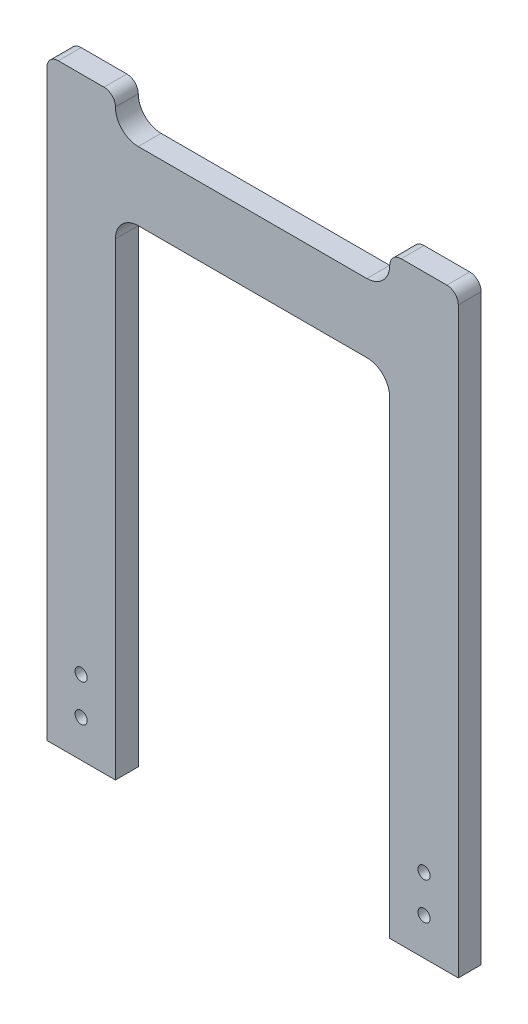
ISO-10303-21;
HEADER;
FILE_DESCRIPTION(('STEP AP214'),'2;1');
FILE_NAME('part.step','',(''),(''),'','','');
FILE_SCHEMA(('AUTOMOTIVE_DESIGN { 1 0 10303 214 1 1 1 1 }'));
ENDSEC;
DATA;
#1=APPLICATION_CONTEXT('core data for automotive mechanical design processes');
#2=APPLICATION_PROTOCOL_DEFINITION('international standard','automotive_design',2000,#1);
#3=PRODUCT_CONTEXT('',#1,'mechanical');
#4=PRODUCT('Part','Part','',(#3));
#5=PRODUCT_RELATED_PRODUCT_CATEGORY('part','',(#4));
#6=PRODUCT_DEFINITION_FORMATION('','',#4);
#7=PRODUCT_DEFINITION_CONTEXT('part definition',#1,'design');
#8=PRODUCT_DEFINITION('design','',#6,#7);
#9=PRODUCT_DEFINITION_SHAPE('','',#8);
#10=(LENGTH_UNIT() NAMED_UNIT(*) SI_UNIT(.MILLI.,.METRE.));
#11=(NAMED_UNIT(*) PLANE_ANGLE_UNIT() SI_UNIT($,.RADIAN.));
#12=(NAMED_UNIT(*) SI_UNIT($,.STERADIAN.) SOLID_ANGLE_UNIT());
#13=UNCERTAINTY_MEASURE_WITH_UNIT(LENGTH_MEASURE(1.E-05),#10,'distance_accuracy_value','');
#14=(GEOMETRIC_REPRESENTATION_CONTEXT(3) GLOBAL_UNCERTAINTY_ASSIGNED_CONTEXT((#13)) GLOBAL_UNIT_ASSIGNED_CONTEXT((#10,
#11,#12)) REPRESENTATION_CONTEXT('',''));
#15=CARTESIAN_POINT('',(0.,0.,0.));
#16=DIRECTION('',(0.,0.,1.));
#17=DIRECTION('',(1.,0.,0.));
#18=AXIS2_PLACEMENT_3D('',#15,#16,#17);
#19=CARTESIAN_POINT('',(-114.3,298.45,12.7));
#20=DIRECTION('',(1.,0.,0.));
#21=DIRECTION('',(0.,1.,0.));
#22=AXIS2_PLACEMENT_3D('',#19,#20,#21);
#23=PLANE('',#22);
#24=DIRECTION('',(0.,-1.,0.));
#25=VECTOR('',#24,1.);
#26=CARTESIAN_POINT('',(-114.3,298.45,12.7));
#27=LINE('',#26,#25);
#28=CARTESIAN_POINT('',(-114.3,292.1,12.7));
#29=VERTEX_POINT('',#28);
#30=CARTESIAN_POINT('',(-114.3,-31.75,12.7));
#31=VERTEX_POINT('',#30);
#32=EDGE_CURVE('E158',#29,#31,#27,.T.);
#33=ORIENTED_EDGE('',*,*,#32,.F.);
#34=DIRECTION('',(0.,0.,-1.));
#35=VECTOR('',#34,1.);
#36=CARTESIAN_POINT('',(-114.3,292.1,12.7));
#37=LINE('',#36,#35);
#38=CARTESIAN_POINT('',(-114.3,292.1,0.));
#39=VERTEX_POINT('',#38);
#40=EDGE_CURVE('E255',#29,#39,#37,.T.);
#41=ORIENTED_EDGE('',*,*,#40,.T.);
#42=DIRECTION('',(0.,-1.,0.));
#43=VECTOR('',#42,1.);
#44=CARTESIAN_POINT('',(-114.3,298.45,0.));
#45=LINE('',#44,#43);
#46=CARTESIAN_POINT('',(-114.3,-31.75,0.));
#47=VERTEX_POINT('',#46);
#48=EDGE_CURVE('E184',#39,#47,#45,.T.);
#49=ORIENTED_EDGE('',*,*,#48,.T.);
#50=DIRECTION('',(0.,0.,-1.));
#51=VECTOR('',#50,1.);
#52=CARTESIAN_POINT('',(-114.3,-31.75,12.7));
#53=LINE('',#52,#51);
#54=EDGE_CURVE('E177',#31,#47,#53,.T.);
#55=ORIENTED_EDGE('',*,*,#54,.F.);
#56=EDGE_LOOP('',(#33,#41,#49,#55));
#57=FACE_BOUND('',#56,.T.);
#58=ADVANCED_FACE('F36',(#57),#23,.F.);
#59=CARTESIAN_POINT('',(-114.3,-31.75,12.7));
#60=DIRECTION('',(0.,1.,0.));
#61=DIRECTION('',(0.,0.,1.));
#62=AXIS2_PLACEMENT_3D('',#59,#60,#61);
#63=PLANE('',#62);
#64=DIRECTION('',(1.,0.,0.));
#65=VECTOR('',#64,1.);
#66=CARTESIAN_POINT('',(-114.3,-31.75,0.));
#67=LINE('',#66,#65);
#68=CARTESIAN_POINT('',(-76.2,-31.75,0.));
#69=VERTEX_POINT('',#68);
#70=EDGE_CURVE('E544',#47,#69,#67,.T.);
#71=ORIENTED_EDGE('',*,*,#70,.T.);
#72=DIRECTION('',(0.,0.,-1.));
#73=VECTOR('',#72,1.);
#74=CARTESIAN_POINT('',(-76.2,-31.75,12.7));
#75=LINE('',#74,#73);
#76=CARTESIAN_POINT('',(-76.2,-31.75,12.7));
#77=VERTEX_POINT('',#76);
#78=EDGE_CURVE('E179',#77,#69,#75,.T.);
#79=ORIENTED_EDGE('',*,*,#78,.F.);
#80=DIRECTION('',(1.,0.,0.));
#81=VECTOR('',#80,1.);
#82=CARTESIAN_POINT('',(-114.3,-31.75,12.7));
#83=LINE('',#82,#81);
#84=EDGE_CURVE('E163',#31,#77,#83,.T.);
#85=ORIENTED_EDGE('',*,*,#84,.F.);
#86=ORIENTED_EDGE('',*,*,#54,.T.);
#87=EDGE_LOOP('',(#71,#79,#85,#86));
#88=FACE_BOUND('',#87,.T.);
#89=ADVANCED_FACE('F176',(#88),#63,.F.);
#90=CARTESIAN_POINT('',(-76.2,-31.75,12.7));
#91=DIRECTION('',(-1.,0.,0.));
#92=DIRECTION('',(0.,0.,1.));
#93=AXIS2_PLACEMENT_3D('',#90,#91,#92);
#94=PLANE('',#93);
#95=DIRECTION('',(0.,1.,0.));
#96=VECTOR('',#95,1.);
#97=CARTESIAN_POINT('',(-76.2,-31.75,0.));
#98=LINE('',#97,#96);
#99=CARTESIAN_POINT('',(-76.2,228.6,0.));
#100=VERTEX_POINT('',#99);
#101=EDGE_CURVE('E542',#69,#100,#98,.T.);
#102=ORIENTED_EDGE('',*,*,#101,.T.);
#103=DIRECTION('',(0.,0.,-1.));
#104=VECTOR('',#103,1.);
#105=CARTESIAN_POINT('',(-76.2,228.6,12.7));
#106=LINE('',#105,#104);
#107=CARTESIAN_POINT('',(-76.2,228.6,12.7));
#108=VERTEX_POINT('',#107);
#109=EDGE_CURVE('E212',#100,#108,#106,.F.);
#110=ORIENTED_EDGE('',*,*,#109,.T.);
#111=DIRECTION('',(0.,1.,0.));
#112=VECTOR('',#111,1.);
#113=CARTESIAN_POINT('',(-76.2,-31.75,12.7));
#114=LINE('',#113,#112);
#115=EDGE_CURVE('E181',#77,#108,#114,.T.);
#116=ORIENTED_EDGE('',*,*,#115,.F.);
#117=ORIENTED_EDGE('',*,*,#78,.T.);
#118=EDGE_LOOP('',(#102,#110,#116,#117));
#119=FACE_BOUND('',#118,.T.);
#120=ADVANCED_FACE('F334',(#119),#94,.F.);
#121=CARTESIAN_POINT('',(-76.2,241.3,12.7));
#122=DIRECTION('',(0.,1.,0.));
#123=DIRECTION('',(-1.,0.,0.));
#124=AXIS2_PLACEMENT_3D('',#121,#122,#123);
#125=PLANE('',#124);
#126=DIRECTION('',(1.,0.,0.));
#127=VECTOR('',#126,1.);
#128=CARTESIAN_POINT('',(-76.2,241.3,0.));
#129=LINE('',#128,#127);
#130=CARTESIAN_POINT('',(-63.5,241.3,0.));
#131=VERTEX_POINT('',#130);
#132=CARTESIAN_POINT('',(63.5,241.3,0.));
#133=VERTEX_POINT('',#132);
#134=EDGE_CURVE('E293',#131,#133,#129,.T.);
#135=ORIENTED_EDGE('',*,*,#134,.T.);
#136=DIRECTION('',(0.,0.,-1.));
#137=VECTOR('',#136,1.);
#138=CARTESIAN_POINT('',(63.5,241.3,12.7));
#139=LINE('',#138,#137);
#140=CARTESIAN_POINT('',(63.5,241.3,12.7));
#141=VERTEX_POINT('',#140);
#142=EDGE_CURVE('E202',#133,#141,#139,.F.);
#143=ORIENTED_EDGE('',*,*,#142,.T.);
#144=DIRECTION('',(1.,0.,0.));
#145=VECTOR('',#144,1.);
#146=CARTESIAN_POINT('',(-76.2,241.3,12.7));
#147=LINE('',#146,#145);
#148=CARTESIAN_POINT('',(-63.5,241.3,12.7));
#149=VERTEX_POINT('',#148);
#150=EDGE_CURVE('E550',#149,#141,#147,.T.);
#151=ORIENTED_EDGE('',*,*,#150,.F.);
#152=DIRECTION('',(0.,0.,-1.));
#153=VECTOR('',#152,1.);
#154=CARTESIAN_POINT('',(-63.5,241.3,0.));
#155=LINE('',#154,#153);
#156=EDGE_CURVE('E189',#149,#131,#155,.T.);
#157=ORIENTED_EDGE('',*,*,#156,.T.);
#158=EDGE_LOOP('',(#135,#143,#151,#157));
#159=FACE_BOUND('',#158,.T.);
#160=ADVANCED_FACE('F497',(#159),#125,.F.);
#161=CARTESIAN_POINT('',(76.2,241.3,12.7));
#162=DIRECTION('',(1.,0.,0.));
#163=DIRECTION('',(0.,0.,-1.));
#164=AXIS2_PLACEMENT_3D('',#161,#162,#163);
#165=PLANE('',#164);
#166=DIRECTION('',(0.,-1.,0.));
#167=VECTOR('',#166,1.);
#168=CARTESIAN_POINT('',(76.2,241.3,12.7));
#169=LINE('',#168,#167);
#170=CARTESIAN_POINT('',(76.2,228.6,12.7));
#171=VERTEX_POINT('',#170);
#172=CARTESIAN_POINT('',(76.2,-31.75,12.7));
#173=VERTEX_POINT('',#172);
#174=EDGE_CURVE('E555',#171,#173,#169,.T.);
#175=ORIENTED_EDGE('',*,*,#174,.F.);
#176=DIRECTION('',(0.,0.,-1.));
#177=VECTOR('',#176,1.);
#178=CARTESIAN_POINT('',(76.2,228.6,0.));
#179=LINE('',#178,#177);
#180=CARTESIAN_POINT('',(76.2,228.6,0.));
#181=VERTEX_POINT('',#180);
#182=EDGE_CURVE('E186',#171,#181,#179,.T.);
#183=ORIENTED_EDGE('',*,*,#182,.T.);
#184=DIRECTION('',(0.,-1.,0.));
#185=VECTOR('',#184,1.);
#186=CARTESIAN_POINT('',(76.2,241.3,0.));
#187=LINE('',#186,#185);
#188=CARTESIAN_POINT('',(76.2,-31.75,0.));
#189=VERTEX_POINT('',#188);
#190=EDGE_CURVE('E288',#181,#189,#187,.T.);
#191=ORIENTED_EDGE('',*,*,#190,.T.);
#192=DIRECTION('',(0.,0.,-1.));
#193=VECTOR('',#192,1.);
#194=CARTESIAN_POINT('',(76.2,-31.75,12.7));
#195=LINE('',#194,#193);
#196=EDGE_CURVE('E191',#173,#189,#195,.T.);
#197=ORIENTED_EDGE('',*,*,#196,.F.);
#198=EDGE_LOOP('',(#175,#183,#191,#197));
#199=FACE_BOUND('',#198,.T.);
#200=ADVANCED_FACE('F489',(#199),#165,.F.);
#201=CARTESIAN_POINT('',(76.2,-31.75,12.7));
#202=DIRECTION('',(0.,1.,0.));
#203=DIRECTION('',(0.,0.,1.));
#204=AXIS2_PLACEMENT_3D('',#201,#202,#203);
#205=PLANE('',#204);
#206=DIRECTION('',(1.,0.,0.));
#207=VECTOR('',#206,1.);
#208=CARTESIAN_POINT('',(76.2,-31.75,0.));
#209=LINE('',#208,#207);
#210=CARTESIAN_POINT('',(114.3,-31.75,0.));
#211=VERTEX_POINT('',#210);
#212=EDGE_CURVE('E282',#189,#211,#209,.T.);
#213=ORIENTED_EDGE('',*,*,#212,.T.);
#214=DIRECTION('',(0.,0.,-1.));
#215=VECTOR('',#214,1.);
#216=CARTESIAN_POINT('',(114.3,-31.75,12.7));
#217=LINE('',#216,#215);
#218=CARTESIAN_POINT('',(114.3,-31.75,12.7));
#219=VERTEX_POINT('',#218);
#220=EDGE_CURVE('E273',#219,#211,#217,.T.);
#221=ORIENTED_EDGE('',*,*,#220,.F.);
#222=DIRECTION('',(1.,0.,0.));
#223=VECTOR('',#222,1.);
#224=CARTESIAN_POINT('',(76.2,-31.75,12.7));
#225=LINE('',#224,#223);
#226=EDGE_CURVE('E283',#173,#219,#225,.T.);
#227=ORIENTED_EDGE('',*,*,#226,.F.);
#228=ORIENTED_EDGE('',*,*,#196,.T.);
#229=EDGE_LOOP('',(#213,#221,#227,#228));
#230=FACE_BOUND('',#229,.T.);
#231=ADVANCED_FACE('F280',(#230),#205,.F.);
#232=CARTESIAN_POINT('',(114.3,-31.75,12.7));
#233=DIRECTION('',(-1.,0.,0.));
#234=DIRECTION('',(0.,-1.,0.));
#235=AXIS2_PLACEMENT_3D('',#232,#233,#234);
#236=PLANE('',#235);
#237=DIRECTION('',(0.,1.,0.));
#238=VECTOR('',#237,1.);
#239=CARTESIAN_POINT('',(114.3,-31.75,0.));
#240=LINE('',#239,#238);
#241=CARTESIAN_POINT('',(114.3,292.1,0.));
#242=VERTEX_POINT('',#241);
#243=EDGE_CURVE('E290',#211,#242,#240,.T.);
#244=ORIENTED_EDGE('',*,*,#243,.T.);
#245=DIRECTION('',(0.,0.,-1.));
#246=VECTOR('',#245,1.);
#247=CARTESIAN_POINT('',(114.3,292.1,12.7));
#248=LINE('',#247,#246);
#249=CARTESIAN_POINT('',(114.3,292.1,12.7));
#250=VERTEX_POINT('',#249);
#251=EDGE_CURVE('E247',#242,#250,#248,.F.);
#252=ORIENTED_EDGE('',*,*,#251,.T.);
#253=DIRECTION('',(0.,1.,0.));
#254=VECTOR('',#253,1.);
#255=CARTESIAN_POINT('',(114.3,-31.75,12.7));
#256=LINE('',#255,#254);
#257=EDGE_CURVE('E562',#219,#250,#256,.T.);
#258=ORIENTED_EDGE('',*,*,#257,.F.);
#259=ORIENTED_EDGE('',*,*,#220,.T.);
#260=EDGE_LOOP('',(#244,#252,#258,#259));
#261=FACE_BOUND('',#260,.T.);
#262=ADVANCED_FACE('F474',(#261),#236,.F.);
#263=CARTESIAN_POINT('',(114.3,298.45,12.7));
#264=DIRECTION('',(0.,-1.,0.));
#265=DIRECTION('',(0.,0.,-1.));
#266=AXIS2_PLACEMENT_3D('',#263,#264,#265);
#267=PLANE('',#266);
#268=DIRECTION('',(-1.,0.,0.));
#269=VECTOR('',#268,1.);
#270=CARTESIAN_POINT('',(114.3,298.45,12.7));
#271=LINE('',#270,#269);
#272=CARTESIAN_POINT('',(107.95,298.45,12.7));
#273=VERTEX_POINT('',#272);
#274=CARTESIAN_POINT('',(82.55,298.45,12.7));
#275=VERTEX_POINT('',#274);
#276=EDGE_CURVE('E310',#273,#275,#271,.T.);
#277=ORIENTED_EDGE('',*,*,#276,.F.);
#278=DIRECTION('',(0.,0.,-1.));
#279=VECTOR('',#278,1.);
#280=CARTESIAN_POINT('',(107.95,298.45,12.7));
#281=LINE('',#280,#279);
#282=CARTESIAN_POINT('',(107.95,298.45,0.));
#283=VERTEX_POINT('',#282);
#284=EDGE_CURVE('E236',#273,#283,#281,.T.);
#285=ORIENTED_EDGE('',*,*,#284,.T.);
#286=DIRECTION('',(-1.,0.,0.));
#287=VECTOR('',#286,1.);
#288=CARTESIAN_POINT('',(114.3,298.45,0.));
#289=LINE('',#288,#287);
#290=CARTESIAN_POINT('',(82.55,298.45,0.));
#291=VERTEX_POINT('',#290);
#292=EDGE_CURVE('E269',#283,#291,#289,.T.);
#293=ORIENTED_EDGE('',*,*,#292,.T.);
#294=DIRECTION('',(0.,0.,-1.));
#295=VECTOR('',#294,1.);
#296=CARTESIAN_POINT('',(82.55,298.45,12.7));
#297=LINE('',#296,#295);
#298=EDGE_CURVE('E234',#291,#275,#297,.F.);
#299=ORIENTED_EDGE('',*,*,#298,.T.);
#300=EDGE_LOOP('',(#277,#285,#293,#299));
#301=FACE_BOUND('',#300,.T.);
#302=ADVANCED_FACE('F300',(#301),#267,.F.);
#303=CARTESIAN_POINT('',(76.2,279.4,12.7));
#304=DIRECTION('',(0.,-1.,0.));
#305=DIRECTION('',(0.,0.,-1.));
#306=AXIS2_PLACEMENT_3D('',#303,#304,#305);
#307=PLANE('',#306);
#308=DIRECTION('',(-1.,0.,0.));
#309=VECTOR('',#308,1.);
#310=CARTESIAN_POINT('',(76.2,279.4,12.7));
#311=LINE('',#310,#309);
#312=CARTESIAN_POINT('',(63.5,279.4,12.7));
#313=VERTEX_POINT('',#312);
#314=CARTESIAN_POINT('',(-63.5,279.4,12.7));
#315=VERTEX_POINT('',#314);
#316=EDGE_CURVE('E318',#313,#315,#311,.T.);
#317=ORIENTED_EDGE('',*,*,#316,.F.);
#318=DIRECTION('',(0.,0.,-1.));
#319=VECTOR('',#318,1.);
#320=CARTESIAN_POINT('',(63.5,279.4,0.));
#321=LINE('',#320,#319);
#322=CARTESIAN_POINT('',(63.5,279.4,0.));
#323=VERTEX_POINT('',#322);
#324=EDGE_CURVE('E206',#313,#323,#321,.T.);
#325=ORIENTED_EDGE('',*,*,#324,.T.);
#326=DIRECTION('',(-1.,0.,0.));
#327=VECTOR('',#326,1.);
#328=CARTESIAN_POINT('',(76.2,279.4,0.));
#329=LINE('',#328,#327);
#330=CARTESIAN_POINT('',(-63.5,279.4,0.));
#331=VERTEX_POINT('',#330);
#332=EDGE_CURVE('E266',#323,#331,#329,.T.);
#333=ORIENTED_EDGE('',*,*,#332,.T.);
#334=DIRECTION('',(0.,0.,-1.));
#335=VECTOR('',#334,1.);
#336=CARTESIAN_POINT('',(-63.5,279.4,12.7));
#337=LINE('',#336,#335);
#338=EDGE_CURVE('E204',#331,#315,#337,.F.);
#339=ORIENTED_EDGE('',*,*,#338,.T.);
#340=EDGE_LOOP('',(#317,#325,#333,#339));
#341=FACE_BOUND('',#340,.T.);
#342=ADVANCED_FACE('F316',(#341),#307,.F.);
#343=CARTESIAN_POINT('',(-76.2,298.45,12.7));
#344=DIRECTION('',(0.,-1.,0.));
#345=DIRECTION('',(1.,0.,0.));
#346=AXIS2_PLACEMENT_3D('',#343,#344,#345);
#347=PLANE('',#346);
#348=DIRECTION('',(-1.,0.,0.));
#349=VECTOR('',#348,1.);
#350=CARTESIAN_POINT('',(-76.2,298.45,0.));
#351=LINE('',#350,#349);
#352=CARTESIAN_POINT('',(-82.55,298.45,0.));
#353=VERTEX_POINT('',#352);
#354=CARTESIAN_POINT('',(-107.95,298.45,0.));
#355=VERTEX_POINT('',#354);
#356=EDGE_CURVE('E172',#353,#355,#351,.T.);
#357=ORIENTED_EDGE('',*,*,#356,.T.);
#358=DIRECTION('',(0.,0.,-1.));
#359=VECTOR('',#358,1.);
#360=CARTESIAN_POINT('',(-107.95,298.45,12.7));
#361=LINE('',#360,#359);
#362=CARTESIAN_POINT('',(-107.95,298.45,12.7));
#363=VERTEX_POINT('',#362);
#364=EDGE_CURVE('E11',#355,#363,#361,.F.);
#365=ORIENTED_EDGE('',*,*,#364,.T.);
#366=DIRECTION('',(-1.,0.,0.));
#367=VECTOR('',#366,1.);
#368=CARTESIAN_POINT('',(-76.2,298.45,12.7));
#369=LINE('',#368,#367);
#370=CARTESIAN_POINT('',(-82.55,298.45,12.7));
#371=VERTEX_POINT('',#370);
#372=EDGE_CURVE('E260',#371,#363,#369,.T.);
#373=ORIENTED_EDGE('',*,*,#372,.F.);
#374=DIRECTION('',(0.,0.,-1.));
#375=VECTOR('',#374,1.);
#376=CARTESIAN_POINT('',(-82.55,298.45,12.7));
#377=LINE('',#376,#375);
#378=EDGE_CURVE('E44',#371,#353,#377,.T.);
#379=ORIENTED_EDGE('',*,*,#378,.T.);
#380=EDGE_LOOP('',(#357,#365,#373,#379));
#381=FACE_BOUND('',#380,.T.);
#382=ADVANCED_FACE('F259',(#381),#347,.F.);
#383=CARTESIAN_POINT('',(0.,0.,12.7));
#384=DIRECTION('',(0.,0.,1.));
#385=DIRECTION('',(1.,0.,0.));
#386=AXIS2_PLACEMENT_3D('',#383,#384,#385);
#387=PLANE('',#386);
#388=CARTESIAN_POINT('',(-95.25,-11.1125,12.7));
#389=DIRECTION('',(0.,0.,1.));
#390=DIRECTION('',(1.,0.,0.));
#391=AXIS2_PLACEMENT_3D('',#388,#389,#390);
#392=CIRCLE('',#391,3.37819999999998);
#393=CARTESIAN_POINT('',(-91.8718,-11.1125,12.7));
#394=VERTEX_POINT('',#393);
#395=EDGE_CURVE('E594',#394,#394,#392,.T.);
#396=ORIENTED_EDGE('',*,*,#395,.F.);
#397=EDGE_LOOP('',(#396));
#398=FACE_BOUND('',#397,.T.);
#399=CARTESIAN_POINT('',(-95.25,9.52500000000001,12.7));
#400=DIRECTION('',(0.,0.,1.));
#401=DIRECTION('',(1.,0.,0.));
#402=AXIS2_PLACEMENT_3D('',#399,#400,#401);
#403=CIRCLE('',#402,3.37819999999998);
#404=CARTESIAN_POINT('',(-91.8718,9.52500000000001,12.7));
#405=VERTEX_POINT('',#404);
#406=EDGE_CURVE('E587',#405,#405,#403,.T.);
#407=ORIENTED_EDGE('',*,*,#406,.F.);
#408=EDGE_LOOP('',(#407));
#409=FACE_BOUND('',#408,.T.);
#410=CARTESIAN_POINT('',(95.25,-11.1125,12.7));
#411=DIRECTION('',(0.,0.,1.));
#412=DIRECTION('',(1.,0.,0.));
#413=AXIS2_PLACEMENT_3D('',#410,#411,#412);
#414=CIRCLE('',#413,3.37819999999998);
#415=CARTESIAN_POINT('',(98.6282,-11.1125,12.7));
#416=VERTEX_POINT('',#415);
#417=EDGE_CURVE('E198',#416,#416,#414,.T.);
#418=ORIENTED_EDGE('',*,*,#417,.F.);
#419=EDGE_LOOP('',(#418));
#420=FACE_BOUND('',#419,.T.);
#421=CARTESIAN_POINT('',(95.25,9.52500000000001,12.7));
#422=DIRECTION('',(0.,0.,1.));
#423=DIRECTION('',(1.,0.,0.));
#424=AXIS2_PLACEMENT_3D('',#421,#422,#423);
#425=CIRCLE('',#424,3.37819999999998);
#426=CARTESIAN_POINT('',(98.6282,9.52500000000001,12.7));
#427=VERTEX_POINT('',#426);
#428=EDGE_CURVE('E197',#427,#427,#425,.T.);
#429=ORIENTED_EDGE('',*,*,#428,.F.);
#430=EDGE_LOOP('',(#429));
#431=FACE_BOUND('',#430,.T.);
#432=ORIENTED_EDGE('',*,*,#257,.T.);
#433=CARTESIAN_POINT('',(107.95,292.1,12.7));
#434=DIRECTION('',(0.,0.,1.));
#435=DIRECTION('',(1.,0.,0.));
#436=AXIS2_PLACEMENT_3D('',#433,#434,#435);
#437=CIRCLE('',#436,6.35);
#438=EDGE_CURVE('E253',#250,#273,#437,.T.);
#439=ORIENTED_EDGE('',*,*,#438,.T.);
#440=ORIENTED_EDGE('',*,*,#276,.T.);
#441=CARTESIAN_POINT('',(82.55,292.1,12.7));
#442=DIRECTION('',(0.,0.,1.));
#443=DIRECTION('',(1.,0.,0.));
#444=AXIS2_PLACEMENT_3D('',#441,#442,#443);
#445=CIRCLE('',#444,6.35);
#446=CARTESIAN_POINT('',(76.2,292.1,12.7));
#447=VERTEX_POINT('',#446);
#448=EDGE_CURVE('E251',#275,#447,#445,.T.);
#449=ORIENTED_EDGE('',*,*,#448,.T.);
#450=CARTESIAN_POINT('',(63.5,292.1,12.7));
#451=DIRECTION('',(0.,0.,1.));
#452=DIRECTION('',(1.,0.,0.));
#453=AXIS2_PLACEMENT_3D('',#450,#451,#452);
#454=CIRCLE('',#453,12.7);
#455=EDGE_CURVE('E224',#447,#313,#454,.F.);
#456=ORIENTED_EDGE('',*,*,#455,.T.);
#457=ORIENTED_EDGE('',*,*,#316,.T.);
#458=CARTESIAN_POINT('',(-63.5,292.1,12.7));
#459=DIRECTION('',(0.,0.,1.));
#460=DIRECTION('',(1.,0.,0.));
#461=AXIS2_PLACEMENT_3D('',#458,#459,#460);
#462=CIRCLE('',#461,12.7);
#463=CARTESIAN_POINT('',(-76.2,292.1,12.7));
#464=VERTEX_POINT('',#463);
#465=EDGE_CURVE('E232',#315,#464,#462,.F.);
#466=ORIENTED_EDGE('',*,*,#465,.T.);
#467=CARTESIAN_POINT('',(-82.55,292.1,12.7));
#468=DIRECTION('',(0.,0.,1.));
#469=DIRECTION('',(1.,0.,0.));
#470=AXIS2_PLACEMENT_3D('',#467,#468,#469);
#471=CIRCLE('',#470,6.35);
#472=EDGE_CURVE('E56',#464,#371,#471,.T.);
#473=ORIENTED_EDGE('',*,*,#472,.T.);
#474=ORIENTED_EDGE('',*,*,#372,.T.);
#475=CARTESIAN_POINT('',(-107.95,292.1,12.7));
#476=DIRECTION('',(0.,0.,1.));
#477=DIRECTION('',(1.,0.,0.));
#478=AXIS2_PLACEMENT_3D('',#475,#476,#477);
#479=CIRCLE('',#478,6.35);
#480=EDGE_CURVE('E166',#363,#29,#479,.T.);
#481=ORIENTED_EDGE('',*,*,#480,.T.);
#482=ORIENTED_EDGE('',*,*,#32,.T.);
#483=ORIENTED_EDGE('',*,*,#84,.T.);
#484=ORIENTED_EDGE('',*,*,#115,.T.);
#485=CARTESIAN_POINT('',(-63.5,228.6,12.7));
#486=DIRECTION('',(0.,0.,1.));
#487=DIRECTION('',(1.,0.,0.));
#488=AXIS2_PLACEMENT_3D('',#485,#486,#487);
#489=CIRCLE('',#488,12.7);
#490=EDGE_CURVE('E228',#108,#149,#489,.F.);
#491=ORIENTED_EDGE('',*,*,#490,.T.);
#492=ORIENTED_EDGE('',*,*,#150,.T.);
#493=CARTESIAN_POINT('',(63.5,228.6,12.7));
#494=DIRECTION('',(0.,0.,1.));
#495=DIRECTION('',(1.,0.,0.));
#496=AXIS2_PLACEMENT_3D('',#493,#494,#495);
#497=CIRCLE('',#496,12.7);
#498=EDGE_CURVE('E219',#141,#171,#497,.F.);
#499=ORIENTED_EDGE('',*,*,#498,.T.);
#500=ORIENTED_EDGE('',*,*,#174,.T.);
#501=ORIENTED_EDGE('',*,*,#226,.T.);
#502=EDGE_LOOP('',(#432,#439,#440,#449,#456,#457,#466,#473,#474,#481,#482,#483,#484,#491,#492,
#499,#500,#501));
#503=FACE_BOUND('',#502,.T.);
#504=ADVANCED_FACE('F161',(#398,#409,#420,#431,#503),#387,.T.);
#505=CARTESIAN_POINT('',(0.,0.,0.));
#506=DIRECTION('',(0.,0.,1.));
#507=DIRECTION('',(1.,0.,0.));
#508=AXIS2_PLACEMENT_3D('',#505,#506,#507);
#509=PLANE('',#508);
#510=CARTESIAN_POINT('',(-95.25,-11.1125,0.));
#511=DIRECTION('',(0.,0.,1.));
#512=DIRECTION('',(1.,0.,0.));
#513=AXIS2_PLACEMENT_3D('',#510,#511,#512);
#514=CIRCLE('',#513,3.37819999999997);
#515=CARTESIAN_POINT('',(-91.8718,-11.1125,0.));
#516=VERTEX_POINT('',#515);
#517=EDGE_CURVE('E591',#516,#516,#514,.T.);
#518=ORIENTED_EDGE('',*,*,#517,.T.);
#519=EDGE_LOOP('',(#518));
#520=FACE_BOUND('',#519,.T.);
#521=CARTESIAN_POINT('',(-95.25,9.52500000000001,0.));
#522=DIRECTION('',(0.,0.,1.));
#523=DIRECTION('',(1.,0.,0.));
#524=AXIS2_PLACEMENT_3D('',#521,#522,#523);
#525=CIRCLE('',#524,3.37819999999997);
#526=CARTESIAN_POINT('',(-91.8718,9.52500000000001,0.));
#527=VERTEX_POINT('',#526);
#528=EDGE_CURVE('E583',#527,#527,#525,.T.);
#529=ORIENTED_EDGE('',*,*,#528,.T.);
#530=EDGE_LOOP('',(#529));
#531=FACE_BOUND('',#530,.T.);
#532=CARTESIAN_POINT('',(95.25,-11.1125,0.));
#533=DIRECTION('',(0.,0.,1.));
#534=DIRECTION('',(1.,0.,0.));
#535=AXIS2_PLACEMENT_3D('',#532,#533,#534);
#536=CIRCLE('',#535,3.37819999999997);
#537=CARTESIAN_POINT('',(98.6282,-11.1125,0.));
#538=VERTEX_POINT('',#537);
#539=EDGE_CURVE('E195',#538,#538,#536,.T.);
#540=ORIENTED_EDGE('',*,*,#539,.T.);
#541=EDGE_LOOP('',(#540));
#542=FACE_BOUND('',#541,.T.);
#543=CARTESIAN_POINT('',(95.25,9.52500000000001,0.));
#544=DIRECTION('',(0.,0.,1.));
#545=DIRECTION('',(1.,0.,0.));
#546=AXIS2_PLACEMENT_3D('',#543,#544,#545);
#547=CIRCLE('',#546,3.37819999999997);
#548=CARTESIAN_POINT('',(98.6282,9.52500000000001,0.));
#549=VERTEX_POINT('',#548);
#550=EDGE_CURVE('E569',#549,#549,#547,.T.);
#551=ORIENTED_EDGE('',*,*,#550,.T.);
#552=EDGE_LOOP('',(#551));
#553=FACE_BOUND('',#552,.T.);
#554=ORIENTED_EDGE('',*,*,#292,.F.);
#555=CARTESIAN_POINT('',(107.95,292.1,0.));
#556=DIRECTION('',(0.,0.,1.));
#557=DIRECTION('',(1.,0.,0.));
#558=AXIS2_PLACEMENT_3D('',#555,#556,#557);
#559=CIRCLE('',#558,6.35);
#560=EDGE_CURVE('E245',#283,#242,#559,.F.);
#561=ORIENTED_EDGE('',*,*,#560,.T.);
#562=ORIENTED_EDGE('',*,*,#243,.F.);
#563=ORIENTED_EDGE('',*,*,#212,.F.);
#564=ORIENTED_EDGE('',*,*,#190,.F.);
#565=CARTESIAN_POINT('',(63.5,228.6,0.));
#566=DIRECTION('',(0.,0.,1.));
#567=DIRECTION('',(1.,0.,0.));
#568=AXIS2_PLACEMENT_3D('',#565,#566,#567);
#569=CIRCLE('',#568,12.7);
#570=EDGE_CURVE('E217',#181,#133,#569,.T.);
#571=ORIENTED_EDGE('',*,*,#570,.T.);
#572=ORIENTED_EDGE('',*,*,#134,.F.);
#573=CARTESIAN_POINT('',(-63.5,228.6,0.));
#574=DIRECTION('',(0.,0.,1.));
#575=DIRECTION('',(1.,0.,0.));
#576=AXIS2_PLACEMENT_3D('',#573,#574,#575);
#577=CIRCLE('',#576,12.7);
#578=EDGE_CURVE('E226',#131,#100,#577,.T.);
#579=ORIENTED_EDGE('',*,*,#578,.T.);
#580=ORIENTED_EDGE('',*,*,#101,.F.);
#581=ORIENTED_EDGE('',*,*,#70,.F.);
#582=ORIENTED_EDGE('',*,*,#48,.F.);
#583=CARTESIAN_POINT('',(-107.95,292.1,0.));
#584=DIRECTION('',(0.,0.,1.));
#585=DIRECTION('',(1.,0.,0.));
#586=AXIS2_PLACEMENT_3D('',#583,#584,#585);
#587=CIRCLE('',#586,6.35);
#588=EDGE_CURVE('E241',#39,#355,#587,.F.);
#589=ORIENTED_EDGE('',*,*,#588,.T.);
#590=ORIENTED_EDGE('',*,*,#356,.F.);
#591=CARTESIAN_POINT('',(-82.55,292.1,0.));
#592=DIRECTION('',(0.,0.,1.));
#593=DIRECTION('',(1.,0.,0.));
#594=AXIS2_PLACEMENT_3D('',#591,#592,#593);
#595=CIRCLE('',#594,6.35);
#596=CARTESIAN_POINT('',(-76.2,292.1,0.));
#597=VERTEX_POINT('',#596);
#598=EDGE_CURVE('E239',#353,#597,#595,.F.);
#599=ORIENTED_EDGE('',*,*,#598,.T.);
#600=CARTESIAN_POINT('',(-63.5,292.1,0.));
#601=DIRECTION('',(0.,0.,1.));
#602=DIRECTION('',(1.,0.,0.));
#603=AXIS2_PLACEMENT_3D('',#600,#601,#602);
#604=CIRCLE('',#603,12.7);
#605=EDGE_CURVE('E230',#597,#331,#604,.T.);
#606=ORIENTED_EDGE('',*,*,#605,.T.);
#607=ORIENTED_EDGE('',*,*,#332,.F.);
#608=CARTESIAN_POINT('',(63.5,292.1,0.));
#609=DIRECTION('',(0.,0.,1.));
#610=DIRECTION('',(1.,0.,0.));
#611=AXIS2_PLACEMENT_3D('',#608,#609,#610);
#612=CIRCLE('',#611,12.7);
#613=CARTESIAN_POINT('',(76.2,292.1,0.));
#614=VERTEX_POINT('',#613);
#615=EDGE_CURVE('E221',#323,#614,#612,.T.);
#616=ORIENTED_EDGE('',*,*,#615,.T.);
#617=CARTESIAN_POINT('',(82.55,292.1,0.));
#618=DIRECTION('',(0.,0.,1.));
#619=DIRECTION('',(1.,0.,0.));
#620=AXIS2_PLACEMENT_3D('',#617,#618,#619);
#621=CIRCLE('',#620,6.35);
#622=EDGE_CURVE('E243',#614,#291,#621,.F.);
#623=ORIENTED_EDGE('',*,*,#622,.T.);
#624=EDGE_LOOP('',(#554,#561,#562,#563,#564,#571,#572,#579,#580,#581,#582,#589,#590,#599,#606,
#607,#616,#623));
#625=FACE_BOUND('',#624,.T.);
#626=ADVANCED_FACE('F264',(#520,#531,#542,#553,#625),#509,.F.);
#627=CARTESIAN_POINT('',(95.25,9.52500000000001,12.7));
#628=DIRECTION('',(0.,0.,1.));
#629=DIRECTION('',(1.,0.,0.));
#630=AXIS2_PLACEMENT_3D('',#627,#628,#629);
#631=CYLINDRICAL_SURFACE('',#630,3.37819999999997);
#632=ORIENTED_EDGE('',*,*,#428,.T.);
#633=EDGE_LOOP('',(#632));
#634=FACE_BOUND('',#633,.T.);
#635=ORIENTED_EDGE('',*,*,#550,.F.);
#636=EDGE_LOOP('',(#635));
#637=FACE_BOUND('',#636,.T.);
#638=ADVANCED_FACE('F426',(#634,#637),#631,.F.);
#639=CARTESIAN_POINT('',(95.25,-11.1125,12.7));
#640=DIRECTION('',(0.,0.,1.));
#641=DIRECTION('',(1.,0.,0.));
#642=AXIS2_PLACEMENT_3D('',#639,#640,#641);
#643=CYLINDRICAL_SURFACE('',#642,3.37819999999997);
#644=ORIENTED_EDGE('',*,*,#417,.T.);
#645=EDGE_LOOP('',(#644));
#646=FACE_BOUND('',#645,.T.);
#647=ORIENTED_EDGE('',*,*,#539,.F.);
#648=EDGE_LOOP('',(#647));
#649=FACE_BOUND('',#648,.T.);
#650=ADVANCED_FACE('F417',(#646,#649),#643,.F.);
#651=CARTESIAN_POINT('',(-95.25,9.52500000000001,12.7));
#652=DIRECTION('',(0.,0.,1.));
#653=DIRECTION('',(1.,0.,0.));
#654=AXIS2_PLACEMENT_3D('',#651,#652,#653);
#655=CYLINDRICAL_SURFACE('',#654,3.37819999999997);
#656=ORIENTED_EDGE('',*,*,#406,.T.);
#657=EDGE_LOOP('',(#656));
#658=FACE_BOUND('',#657,.T.);
#659=ORIENTED_EDGE('',*,*,#528,.F.);
#660=EDGE_LOOP('',(#659));
#661=FACE_BOUND('',#660,.T.);
#662=ADVANCED_FACE('F407',(#658,#661),#655,.F.);
#663=CARTESIAN_POINT('',(-95.25,-11.1125,12.7));
#664=DIRECTION('',(0.,0.,1.));
#665=DIRECTION('',(1.,0.,0.));
#666=AXIS2_PLACEMENT_3D('',#663,#664,#665);
#667=CYLINDRICAL_SURFACE('',#666,3.37819999999997);
#668=ORIENTED_EDGE('',*,*,#395,.T.);
#669=EDGE_LOOP('',(#668));
#670=FACE_BOUND('',#669,.T.);
#671=ORIENTED_EDGE('',*,*,#517,.F.);
#672=EDGE_LOOP('',(#671));
#673=FACE_BOUND('',#672,.T.);
#674=ADVANCED_FACE('F341',(#670,#673),#667,.F.);
#675=CARTESIAN_POINT('',(63.5,228.6,12.7));
#676=DIRECTION('',(0.,0.,1.));
#677=DIRECTION('',(1.,0.,0.));
#678=AXIS2_PLACEMENT_3D('',#675,#676,#677);
#679=CYLINDRICAL_SURFACE('',#678,12.7);
#680=ORIENTED_EDGE('',*,*,#498,.F.);
#681=ORIENTED_EDGE('',*,*,#142,.F.);
#682=ORIENTED_EDGE('',*,*,#570,.F.);
#683=ORIENTED_EDGE('',*,*,#182,.F.);
#684=EDGE_LOOP('',(#680,#681,#682,#683));
#685=FACE_BOUND('',#684,.T.);
#686=ADVANCED_FACE('F338',(#685),#679,.F.);
#687=CARTESIAN_POINT('',(63.5,292.1,12.7));
#688=DIRECTION('',(0.,0.,1.));
#689=DIRECTION('',(1.,0.,0.));
#690=AXIS2_PLACEMENT_3D('',#687,#688,#689);
#691=CYLINDRICAL_SURFACE('',#690,12.7);
#692=ORIENTED_EDGE('',*,*,#455,.F.);
#693=DIRECTION('',(0.,0.,-1.));
#694=VECTOR('',#693,1.);
#695=CARTESIAN_POINT('',(76.2,292.1,12.7));
#696=LINE('',#695,#694);
#697=EDGE_CURVE('E209',#614,#447,#696,.F.);
#698=ORIENTED_EDGE('',*,*,#697,.F.);
#699=ORIENTED_EDGE('',*,*,#615,.F.);
#700=ORIENTED_EDGE('',*,*,#324,.F.);
#701=EDGE_LOOP('',(#692,#698,#699,#700));
#702=FACE_BOUND('',#701,.T.);
#703=ADVANCED_FACE('F313',(#702),#691,.F.);
#704=CARTESIAN_POINT('',(-63.5,228.6,12.7));
#705=DIRECTION('',(0.,0.,1.));
#706=DIRECTION('',(1.,0.,0.));
#707=AXIS2_PLACEMENT_3D('',#704,#705,#706);
#708=CYLINDRICAL_SURFACE('',#707,12.7);
#709=ORIENTED_EDGE('',*,*,#490,.F.);
#710=ORIENTED_EDGE('',*,*,#109,.F.);
#711=ORIENTED_EDGE('',*,*,#578,.F.);
#712=ORIENTED_EDGE('',*,*,#156,.F.);
#713=EDGE_LOOP('',(#709,#710,#711,#712));
#714=FACE_BOUND('',#713,.T.);
#715=ADVANCED_FACE('F345',(#714),#708,.F.);
#716=CARTESIAN_POINT('',(-63.5,292.1,12.7));
#717=DIRECTION('',(0.,0.,1.));
#718=DIRECTION('',(1.,0.,0.));
#719=AXIS2_PLACEMENT_3D('',#716,#717,#718);
#720=CYLINDRICAL_SURFACE('',#719,12.7);
#721=ORIENTED_EDGE('',*,*,#465,.F.);
#722=ORIENTED_EDGE('',*,*,#338,.F.);
#723=ORIENTED_EDGE('',*,*,#605,.F.);
#724=DIRECTION('',(0.,0.,-1.));
#725=VECTOR('',#724,1.);
#726=CARTESIAN_POINT('',(-76.2,292.1,0.));
#727=LINE('',#726,#725);
#728=EDGE_CURVE('E214',#464,#597,#727,.T.);
#729=ORIENTED_EDGE('',*,*,#728,.F.);
#730=EDGE_LOOP('',(#721,#722,#723,#729));
#731=FACE_BOUND('',#730,.T.);
#732=ADVANCED_FACE('F322',(#731),#720,.F.);
#733=CARTESIAN_POINT('',(107.95,292.1,12.7));
#734=DIRECTION('',(0.,0.,-1.));
#735=DIRECTION('',(-1.,0.,0.));
#736=AXIS2_PLACEMENT_3D('',#733,#734,#735);
#737=CYLINDRICAL_SURFACE('',#736,6.35);
#738=ORIENTED_EDGE('',*,*,#438,.F.);
#739=ORIENTED_EDGE('',*,*,#251,.F.);
#740=ORIENTED_EDGE('',*,*,#560,.F.);
#741=ORIENTED_EDGE('',*,*,#284,.F.);
#742=EDGE_LOOP('',(#738,#739,#740,#741));
#743=FACE_BOUND('',#742,.T.);
#744=ADVANCED_FACE('F351',(#743),#737,.T.);
#745=CARTESIAN_POINT('',(82.55,292.1,12.7));
#746=DIRECTION('',(0.,0.,-1.));
#747=DIRECTION('',(-1.,0.,0.));
#748=AXIS2_PLACEMENT_3D('',#745,#746,#747);
#749=CYLINDRICAL_SURFACE('',#748,6.35);
#750=ORIENTED_EDGE('',*,*,#448,.F.);
#751=ORIENTED_EDGE('',*,*,#298,.F.);
#752=ORIENTED_EDGE('',*,*,#622,.F.);
#753=ORIENTED_EDGE('',*,*,#697,.T.);
#754=EDGE_LOOP('',(#750,#751,#752,#753));
#755=FACE_BOUND('',#754,.T.);
#756=ADVANCED_FACE('F305',(#755),#749,.T.);
#757=CARTESIAN_POINT('',(-107.95,292.1,12.7));
#758=DIRECTION('',(0.,0.,-1.));
#759=DIRECTION('',(-1.,0.,0.));
#760=AXIS2_PLACEMENT_3D('',#757,#758,#759);
#761=CYLINDRICAL_SURFACE('',#760,6.35);
#762=ORIENTED_EDGE('',*,*,#480,.F.);
#763=ORIENTED_EDGE('',*,*,#364,.F.);
#764=ORIENTED_EDGE('',*,*,#588,.F.);
#765=ORIENTED_EDGE('',*,*,#40,.F.);
#766=EDGE_LOOP('',(#762,#763,#764,#765));
#767=FACE_BOUND('',#766,.T.);
#768=ADVANCED_FACE('F324',(#767),#761,.T.);
#769=CARTESIAN_POINT('',(-82.55,292.1,12.7));
#770=DIRECTION('',(0.,0.,-1.));
#771=DIRECTION('',(-1.,0.,0.));
#772=AXIS2_PLACEMENT_3D('',#769,#770,#771);
#773=CYLINDRICAL_SURFACE('',#772,6.35);
#774=ORIENTED_EDGE('',*,*,#472,.F.);
#775=ORIENTED_EDGE('',*,*,#728,.T.);
#776=ORIENTED_EDGE('',*,*,#598,.F.);
#777=ORIENTED_EDGE('',*,*,#378,.F.);
#778=EDGE_LOOP('',(#774,#775,#776,#777));
#779=FACE_BOUND('',#778,.T.);
#780=ADVANCED_FACE('F38',(#779),#773,.T.);
#781=CLOSED_SHELL('',(#58,#89,#120,#160,#200,#231,#262,#302,#342,#382,#504,#626,#638,#650,#662,
#674,#686,#703,#715,#732,#744,#756,#768,#780));
#782=MANIFOLD_SOLID_BREP('B2',#781);
#783=ADVANCED_BREP_SHAPE_REPRESENTATION('',(#18,#782),#14);
#784=SHAPE_DEFINITION_REPRESENTATION(#9,#783);
ENDSEC;
END-ISO-10303-21;
